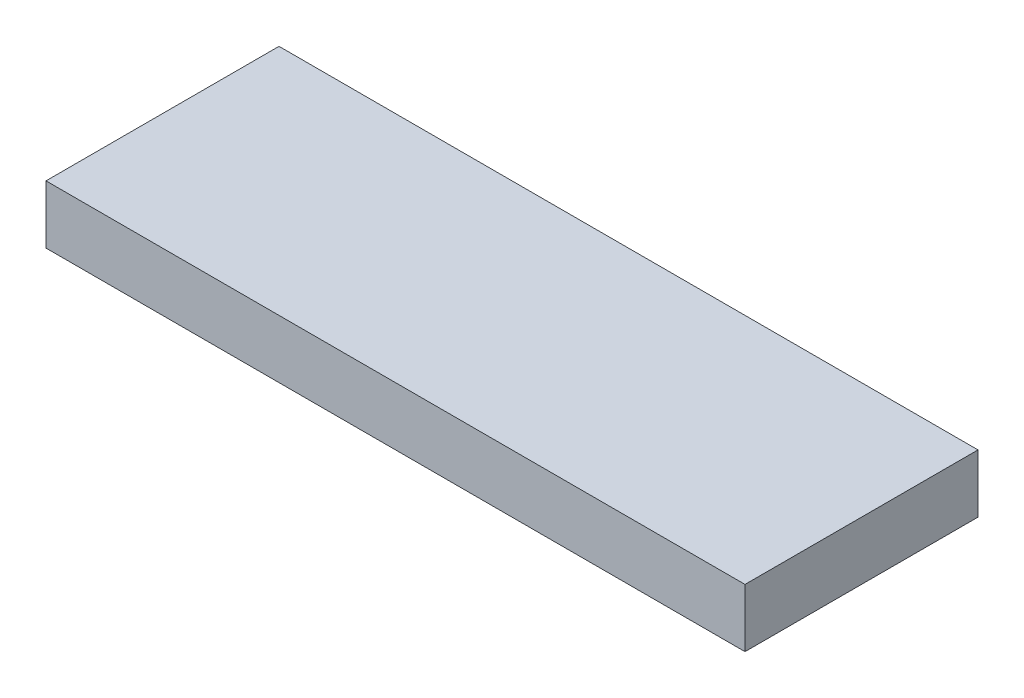
ISO-10303-21;
HEADER;
FILE_DESCRIPTION(('STEP AP214'),'2;1');
FILE_NAME('part.step','',(''),(''),'','','');
FILE_SCHEMA(('AUTOMOTIVE_DESIGN { 1 0 10303 214 1 1 1 1 }'));
ENDSEC;
DATA;
#1=APPLICATION_CONTEXT('core data for automotive mechanical design processes');
#2=APPLICATION_PROTOCOL_DEFINITION('international standard','automotive_design',2000,#1);
#3=PRODUCT_CONTEXT('',#1,'mechanical');
#4=PRODUCT('Part','Part','',(#3));
#5=PRODUCT_RELATED_PRODUCT_CATEGORY('part','',(#4));
#6=PRODUCT_DEFINITION_FORMATION('','',#4);
#7=PRODUCT_DEFINITION_CONTEXT('part definition',#1,'design');
#8=PRODUCT_DEFINITION('design','',#6,#7);
#9=PRODUCT_DEFINITION_SHAPE('','',#8);
#10=(LENGTH_UNIT() NAMED_UNIT(*) SI_UNIT(.MILLI.,.METRE.));
#11=(NAMED_UNIT(*) PLANE_ANGLE_UNIT() SI_UNIT($,.RADIAN.));
#12=(NAMED_UNIT(*) SI_UNIT($,.STERADIAN.) SOLID_ANGLE_UNIT());
#13=UNCERTAINTY_MEASURE_WITH_UNIT(LENGTH_MEASURE(1.E-05),#10,'distance_accuracy_value','');
#14=(GEOMETRIC_REPRESENTATION_CONTEXT(3) GLOBAL_UNCERTAINTY_ASSIGNED_CONTEXT((#13)) GLOBAL_UNIT_ASSIGNED_CONTEXT((#10,
#11,#12)) REPRESENTATION_CONTEXT('',''));
#15=CARTESIAN_POINT('',(0.,0.,0.));
#16=DIRECTION('',(0.,0.,1.));
#17=DIRECTION('',(1.,0.,0.));
#18=AXIS2_PLACEMENT_3D('',#15,#16,#17);
#19=CARTESIAN_POINT('',(-228.6,38.1,76.2));
#20=DIRECTION('',(1.,0.,0.));
#21=DIRECTION('',(0.,0.,-1.));
#22=AXIS2_PLACEMENT_3D('',#19,#20,#21);
#23=PLANE('',#22);
#24=DIRECTION('',(0.,0.,1.));
#25=VECTOR('',#24,1.);
#26=CARTESIAN_POINT('',(-228.6,0.,76.2));
#27=LINE('',#26,#25);
#28=CARTESIAN_POINT('',(-228.6,0.,-76.2));
#29=VERTEX_POINT('',#28);
#30=CARTESIAN_POINT('',(-228.6,0.,76.2));
#31=VERTEX_POINT('',#30);
#32=EDGE_CURVE('E96',#29,#31,#27,.T.);
#33=ORIENTED_EDGE('',*,*,#32,.T.);
#34=DIRECTION('',(0.,-1.,0.));
#35=VECTOR('',#34,1.);
#36=CARTESIAN_POINT('',(-228.6,38.1,76.2));
#37=LINE('',#36,#35);
#38=CARTESIAN_POINT('',(-228.6,38.1,76.2));
#39=VERTEX_POINT('',#38);
#40=EDGE_CURVE('E11',#39,#31,#37,.T.);
#41=ORIENTED_EDGE('',*,*,#40,.F.);
#42=DIRECTION('',(0.,0.,1.));
#43=VECTOR('',#42,1.);
#44=CARTESIAN_POINT('',(-228.6,38.1,76.2));
#45=LINE('',#44,#43);
#46=CARTESIAN_POINT('',(-228.6,38.1,-76.2));
#47=VERTEX_POINT('',#46);
#48=EDGE_CURVE('E84',#47,#39,#45,.T.);
#49=ORIENTED_EDGE('',*,*,#48,.F.);
#50=DIRECTION('',(0.,-1.,0.));
#51=VECTOR('',#50,1.);
#52=CARTESIAN_POINT('',(-228.6,38.1,-76.2));
#53=LINE('',#52,#51);
#54=EDGE_CURVE('E92',#47,#29,#53,.T.);
#55=ORIENTED_EDGE('',*,*,#54,.T.);
#56=EDGE_LOOP('',(#33,#41,#49,#55));
#57=FACE_BOUND('',#56,.T.);
#58=ADVANCED_FACE('F33',(#57),#23,.F.);
#59=CARTESIAN_POINT('',(228.6,38.1,76.2));
#60=DIRECTION('',(0.,0.,-1.));
#61=DIRECTION('',(-1.,0.,0.));
#62=AXIS2_PLACEMENT_3D('',#59,#60,#61);
#63=PLANE('',#62);
#64=DIRECTION('',(1.,0.,0.));
#65=VECTOR('',#64,1.);
#66=CARTESIAN_POINT('',(228.6,0.,76.2));
#67=LINE('',#66,#65);
#68=CARTESIAN_POINT('',(228.6,0.,76.2));
#69=VERTEX_POINT('',#68);
#70=EDGE_CURVE('E88',#31,#69,#67,.T.);
#71=ORIENTED_EDGE('',*,*,#70,.T.);
#72=DIRECTION('',(0.,-1.,0.));
#73=VECTOR('',#72,1.);
#74=CARTESIAN_POINT('',(228.6,38.1,76.2));
#75=LINE('',#74,#73);
#76=CARTESIAN_POINT('',(228.6,38.1,76.2));
#77=VERTEX_POINT('',#76);
#78=EDGE_CURVE('E41',#77,#69,#75,.T.);
#79=ORIENTED_EDGE('',*,*,#78,.F.);
#80=DIRECTION('',(1.,0.,0.));
#81=VECTOR('',#80,1.);
#82=CARTESIAN_POINT('',(228.6,38.1,76.2));
#83=LINE('',#82,#81);
#84=EDGE_CURVE('E79',#39,#77,#83,.T.);
#85=ORIENTED_EDGE('',*,*,#84,.F.);
#86=ORIENTED_EDGE('',*,*,#40,.T.);
#87=EDGE_LOOP('',(#71,#79,#85,#86));
#88=FACE_BOUND('',#87,.T.);
#89=ADVANCED_FACE('F87',(#88),#63,.F.);
#90=CARTESIAN_POINT('',(228.6,38.1,76.2));
#91=DIRECTION('',(-1.,0.,0.));
#92=DIRECTION('',(0.,0.,1.));
#93=AXIS2_PLACEMENT_3D('',#90,#91,#92);
#94=PLANE('',#93);
#95=DIRECTION('',(0.,0.,-1.));
#96=VECTOR('',#95,1.);
#97=CARTESIAN_POINT('',(228.6,0.,76.2));
#98=LINE('',#97,#96);
#99=CARTESIAN_POINT('',(228.6,0.,-76.2));
#100=VERTEX_POINT('',#99);
#101=EDGE_CURVE('E66',#69,#100,#98,.T.);
#102=ORIENTED_EDGE('',*,*,#101,.T.);
#103=DIRECTION('',(0.,-1.,0.));
#104=VECTOR('',#103,1.);
#105=CARTESIAN_POINT('',(228.6,38.1,-76.2));
#106=LINE('',#105,#104);
#107=CARTESIAN_POINT('',(228.6,38.1,-76.2));
#108=VERTEX_POINT('',#107);
#109=EDGE_CURVE('E89',#108,#100,#106,.T.);
#110=ORIENTED_EDGE('',*,*,#109,.F.);
#111=DIRECTION('',(0.,0.,-1.));
#112=VECTOR('',#111,1.);
#113=CARTESIAN_POINT('',(228.6,38.1,76.2));
#114=LINE('',#113,#112);
#115=EDGE_CURVE('E82',#77,#108,#114,.T.);
#116=ORIENTED_EDGE('',*,*,#115,.F.);
#117=ORIENTED_EDGE('',*,*,#78,.T.);
#118=EDGE_LOOP('',(#102,#110,#116,#117));
#119=FACE_BOUND('',#118,.T.);
#120=ADVANCED_FACE('F90',(#119),#94,.F.);
#121=CARTESIAN_POINT('',(228.6,38.1,-76.2));
#122=DIRECTION('',(0.,0.,1.));
#123=DIRECTION('',(1.,0.,0.));
#124=AXIS2_PLACEMENT_3D('',#121,#122,#123);
#125=PLANE('',#124);
#126=DIRECTION('',(-1.,0.,0.));
#127=VECTOR('',#126,1.);
#128=CARTESIAN_POINT('',(228.6,0.,-76.2));
#129=LINE('',#128,#127);
#130=EDGE_CURVE('E72',#100,#29,#129,.T.);
#131=ORIENTED_EDGE('',*,*,#130,.T.);
#132=ORIENTED_EDGE('',*,*,#54,.F.);
#133=DIRECTION('',(-1.,0.,0.));
#134=VECTOR('',#133,1.);
#135=CARTESIAN_POINT('',(228.6,38.1,-76.2));
#136=LINE('',#135,#134);
#137=EDGE_CURVE('E49',#108,#47,#136,.T.);
#138=ORIENTED_EDGE('',*,*,#137,.F.);
#139=ORIENTED_EDGE('',*,*,#109,.T.);
#140=EDGE_LOOP('',(#131,#132,#138,#139));
#141=FACE_BOUND('',#140,.T.);
#142=ADVANCED_FACE('F103',(#141),#125,.F.);
#143=CARTESIAN_POINT('',(0.,38.1,0.));
#144=DIRECTION('',(0.,1.,0.));
#145=DIRECTION('',(0.,0.,1.));
#146=AXIS2_PLACEMENT_3D('',#143,#144,#145);
#147=PLANE('',#146);
#148=ORIENTED_EDGE('',*,*,#48,.T.);
#149=ORIENTED_EDGE('',*,*,#84,.T.);
#150=ORIENTED_EDGE('',*,*,#115,.T.);
#151=ORIENTED_EDGE('',*,*,#137,.T.);
#152=EDGE_LOOP('',(#148,#149,#150,#151));
#153=FACE_BOUND('',#152,.T.);
#154=ADVANCED_FACE('F80',(#153),#147,.T.);
#155=CARTESIAN_POINT('',(0.,0.,0.));
#156=DIRECTION('',(0.,1.,0.));
#157=DIRECTION('',(0.,0.,1.));
#158=AXIS2_PLACEMENT_3D('',#155,#156,#157);
#159=PLANE('',#158);
#160=ORIENTED_EDGE('',*,*,#32,.F.);
#161=ORIENTED_EDGE('',*,*,#130,.F.);
#162=ORIENTED_EDGE('',*,*,#101,.F.);
#163=ORIENTED_EDGE('',*,*,#70,.F.);
#164=EDGE_LOOP('',(#160,#161,#162,#163));
#165=FACE_BOUND('',#164,.T.);
#166=ADVANCED_FACE('F106',(#165),#159,.F.);
#167=CLOSED_SHELL('',(#58,#89,#120,#142,#154,#166));
#168=MANIFOLD_SOLID_BREP('B2',#167);
#169=ADVANCED_BREP_SHAPE_REPRESENTATION('',(#18,#168),#14);
#170=SHAPE_DEFINITION_REPRESENTATION(#9,#169);
ENDSEC;
END-ISO-10303-21;
